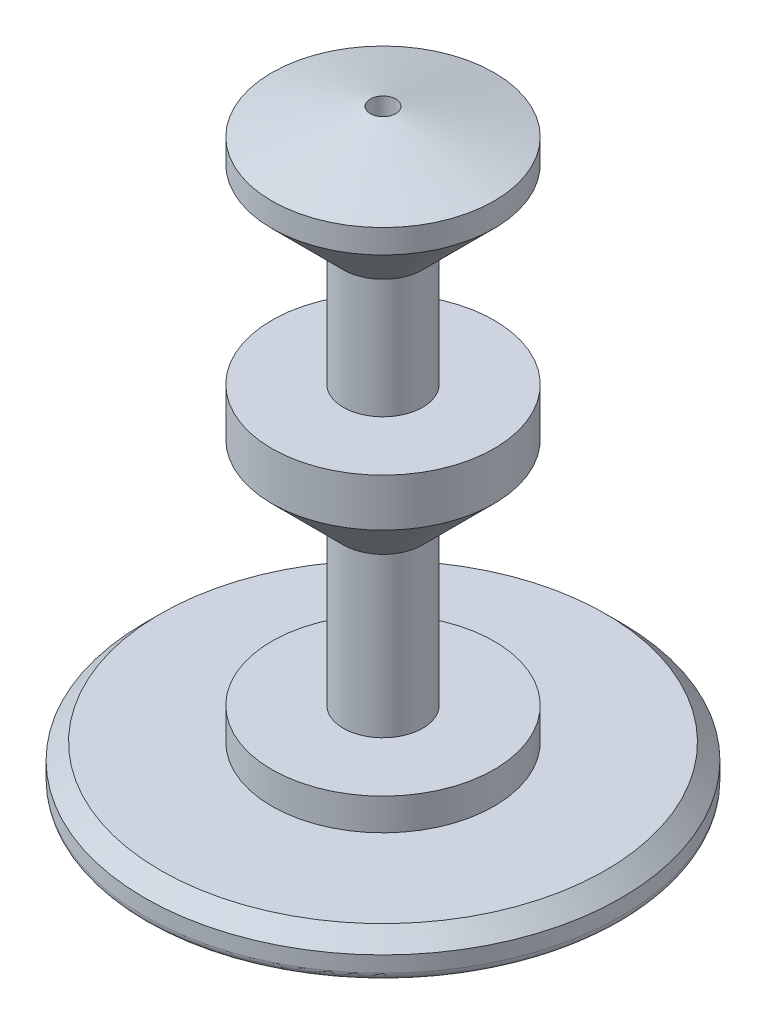
ISO-10303-21;
HEADER;
FILE_DESCRIPTION(('STEP AP214'),'2;1');
FILE_NAME('part.step','',(''),(''),'','','');
FILE_SCHEMA(('AUTOMOTIVE_DESIGN { 1 0 10303 214 1 1 1 1 }'));
ENDSEC;
DATA;
#1=APPLICATION_CONTEXT('core data for automotive mechanical design processes');
#2=APPLICATION_PROTOCOL_DEFINITION('international standard','automotive_design',2000,#1);
#3=PRODUCT_CONTEXT('',#1,'mechanical');
#4=PRODUCT('Part','Part','',(#3));
#5=PRODUCT_RELATED_PRODUCT_CATEGORY('part','',(#4));
#6=PRODUCT_DEFINITION_FORMATION('','',#4);
#7=PRODUCT_DEFINITION_CONTEXT('part definition',#1,'design');
#8=PRODUCT_DEFINITION('design','',#6,#7);
#9=PRODUCT_DEFINITION_SHAPE('','',#8);
#10=(LENGTH_UNIT() NAMED_UNIT(*) SI_UNIT(.MILLI.,.METRE.));
#11=(NAMED_UNIT(*) PLANE_ANGLE_UNIT() SI_UNIT($,.RADIAN.));
#12=(NAMED_UNIT(*) SI_UNIT($,.STERADIAN.) SOLID_ANGLE_UNIT());
#13=UNCERTAINTY_MEASURE_WITH_UNIT(LENGTH_MEASURE(1.E-05),#10,'distance_accuracy_value','');
#14=(GEOMETRIC_REPRESENTATION_CONTEXT(3) GLOBAL_UNCERTAINTY_ASSIGNED_CONTEXT((#13)) GLOBAL_UNIT_ASSIGNED_CONTEXT((#10,
#11,#12)) REPRESENTATION_CONTEXT('',''));
#15=CARTESIAN_POINT('',(0.,0.,0.));
#16=DIRECTION('',(0.,0.,1.));
#17=DIRECTION('',(1.,0.,0.));
#18=AXIS2_PLACEMENT_3D('',#15,#16,#17);
#19=CARTESIAN_POINT('',(0.,17.8951612903226,0.));
#20=DIRECTION('',(0.,-1.,0.));
#21=DIRECTION('',(0.,0.,-1.));
#22=AXIS2_PLACEMENT_3D('',#19,#20,#21);
#23=CONICAL_SURFACE('',#22,14.,1.30899693899575);
#24=CARTESIAN_POINT('',(0.,17.8951612903226,0.));
#25=DIRECTION('',(0.,1.,0.));
#26=DIRECTION('',(0.,0.,1.));
#27=AXIS2_PLACEMENT_3D('',#24,#25,#26);
#28=CIRCLE('',#27,14.);
#29=CARTESIAN_POINT('',(0.,17.8951612903226,-14.));
#30=VERTEX_POINT('',#29);
#31=EDGE_CURVE('E68',#30,#30,#28,.T.);
#32=CARTESIAN_POINT('',(0.,21.2177312764685,0.));
#33=DIRECTION('',(0.,-1.,0.));
#34=DIRECTION('',(0.,0.,-1.));
#35=AXIS2_PLACEMENT_3D('',#32,#33,#34);
#36=CIRCLE('',#35,1.6);
#37=CARTESIAN_POINT('',(0.,21.2177312764685,-1.59999999999999));
#38=VERTEX_POINT('',#37);
#39=EDGE_CURVE('E40',#38,#38,#36,.F.);
#40=CARTESIAN_POINT('',(0.,17.8951612903226,-14.));
#41=CARTESIAN_POINT('',(0.,17.9297713943449,-13.8708333333333));
#42=CARTESIAN_POINT('',(0.,17.9643814983673,-13.7416666666667));
#43=CARTESIAN_POINT('',(0.,18.033601706412,-13.4833333333333));
#44=CARTESIAN_POINT('',(0.,18.0682118104343,-13.3541666666667));
#45=CARTESIAN_POINT('',(0.,18.1374320184791,-13.0958333333333));
#46=CARTESIAN_POINT('',(0.,18.1720421225014,-12.9666666666667));
#47=CARTESIAN_POINT('',(0.,18.2412623305461,-12.7083333333333));
#48=CARTESIAN_POINT('',(0.,18.2758724345685,-12.5791666666667));
#49=CARTESIAN_POINT('',(0.,18.3450926426132,-12.3208333333333));
#50=CARTESIAN_POINT('',(0.,18.3797027466355,-12.1916666666667));
#51=CARTESIAN_POINT('',(0.,18.4489229546802,-11.9333333333333));
#52=CARTESIAN_POINT('',(0.,18.4835330587026,-11.8041666666667));
#53=CARTESIAN_POINT('',(0.,18.5527532667473,-11.5458333333333));
#54=CARTESIAN_POINT('',(0.,18.5873633707696,-11.4166666666667));
#55=CARTESIAN_POINT('',(0.,18.6565835788143,-11.1583333333333));
#56=CARTESIAN_POINT('',(0.,18.6911936828367,-11.0291666666667));
#57=CARTESIAN_POINT('',(0.,18.7604138908814,-10.7708333333333));
#58=CARTESIAN_POINT('',(0.,18.7950239949038,-10.6416666666667));
#59=CARTESIAN_POINT('',(0.,18.8642442029485,-10.3833333333333));
#60=CARTESIAN_POINT('',(0.,18.8988543069708,-10.2541666666667));
#61=CARTESIAN_POINT('',(0.,18.9680745150155,-9.99583333333334));
#62=CARTESIAN_POINT('',(0.,19.0026846190379,-9.86666666666667));
#63=CARTESIAN_POINT('',(0.,19.0719048270826,-9.60833333333334));
#64=CARTESIAN_POINT('',(0.,19.1065149311049,-9.47916666666667));
#65=CARTESIAN_POINT('',(0.,19.1757351391496,-9.22083333333334));
#66=CARTESIAN_POINT('',(0.,19.210345243172,-9.09166666666667));
#67=CARTESIAN_POINT('',(0.,19.2795654512167,-8.83333333333334));
#68=CARTESIAN_POINT('',(0.,19.3141755552391,-8.70416666666667));
#69=CARTESIAN_POINT('',(0.,19.3833957632838,-8.44583333333334));
#70=CARTESIAN_POINT('',(0.,19.4180058673061,-8.31666666666667));
#71=CARTESIAN_POINT('',(0.,19.4872260753508,-8.05833333333334));
#72=CARTESIAN_POINT('',(0.,19.5218361793732,-7.92916666666667));
#73=CARTESIAN_POINT('',(0.,19.5910563874179,-7.67083333333334));
#74=CARTESIAN_POINT('',(0.,19.6256664914402,-7.54166666666667));
#75=CARTESIAN_POINT('',(0.,19.6948866994849,-7.28333333333334));
#76=CARTESIAN_POINT('',(0.,19.7294968035073,-7.15416666666667));
#77=CARTESIAN_POINT('',(0.,19.798717011552,-6.89583333333334));
#78=CARTESIAN_POINT('',(0.,19.8333271155743,-6.76666666666667));
#79=CARTESIAN_POINT('',(0.,19.9025473236191,-6.50833333333333));
#80=CARTESIAN_POINT('',(0.,19.9371574276414,-6.37916666666667));
#81=CARTESIAN_POINT('',(0.,20.0063776356861,-6.12083333333333));
#82=CARTESIAN_POINT('',(0.,20.0409877397085,-5.99166666666667));
#83=CARTESIAN_POINT('',(0.,20.1102079477532,-5.73333333333333));
#84=CARTESIAN_POINT('',(0.,20.1448180517755,-5.60416666666667));
#85=CARTESIAN_POINT('',(0.,20.2140382598202,-5.34583333333333));
#86=CARTESIAN_POINT('',(0.,20.2486483638426,-5.21666666666667));
#87=CARTESIAN_POINT('',(0.,20.3178685718873,-4.95833333333333));
#88=CARTESIAN_POINT('',(0.,20.3524786759096,-4.82916666666666));
#89=CARTESIAN_POINT('',(0.,20.4216988839544,-4.57083333333333));
#90=CARTESIAN_POINT('',(0.,20.4563089879767,-4.44166666666666));
#91=CARTESIAN_POINT('',(0.,20.5255291960214,-4.18333333333333));
#92=CARTESIAN_POINT('',(0.,20.5601393000438,-4.05416666666667));
#93=CARTESIAN_POINT('',(0.,20.6293595080885,-3.79583333333333));
#94=CARTESIAN_POINT('',(0.,20.6639696121108,-3.66666666666666));
#95=CARTESIAN_POINT('',(0.,20.7331898201555,-3.40833333333333));
#96=CARTESIAN_POINT('',(0.,20.7677999241779,-3.27916666666666));
#97=CARTESIAN_POINT('',(0.,20.8370201322226,-3.02083333333333));
#98=CARTESIAN_POINT('',(0.,20.8716302362449,-2.89166666666666));
#99=CARTESIAN_POINT('',(0.,20.9408504442896,-2.63333333333333));
#100=CARTESIAN_POINT('',(0.,20.975460548312,-2.50416666666666));
#101=CARTESIAN_POINT('',(0.,21.0446807563567,-2.24583333333333));
#102=CARTESIAN_POINT('',(0.,21.0792908603791,-2.11666666666666));
#103=CARTESIAN_POINT('',(0.,21.1485110684238,-1.85833333333333));
#104=CARTESIAN_POINT('',(0.,21.1831211724461,-1.72916666666666));
#105=CARTESIAN_POINT('',(0.,21.2177312764685,-1.59999999999999));
#106=B_SPLINE_CURVE_WITH_KNOTS('',3,(#40,#41,#42,#43,#44,#45,#46,#47,#48,#49,#50,#51,#52,#53,
#54,#55,#56,#57,#58,#59,#60,#61,#62,#63,#64,#65,#66,#67,#68,#69,#70,#71,#72,#73,#74,#75,#76,#77,
#78,#79,#80,#81,#82,#83,#84,#85,#86,#87,#88,#89,#90,#91,#92,#93,#94,#95,#96,#97,#98,#99,#100,
#101,#102,#103,#104,#105),.UNSPECIFIED.,.F.,.F.,(4,2,2,2,2,2,2,2,2,2,2,2,2,2,2,2,2,2,2,2,2,2,2,
2,2,2,2,2,2,2,2,2,4),(0.,0.401169519908908,0.802339039817815,1.20350855972672,1.60467807963563,
2.00584759954454,2.40701711945345,2.80818663936235,3.20935615927126,3.61052567918017,
4.01169519908908,4.41286471899798,4.81403423890689,5.2152037588158,5.6163732787247,
6.01754279863361,6.41871231854252,6.81988183845143,7.22105135836033,7.62222087826924,
8.02339039817815,8.42455991808706,8.82572943799597,9.22689895790487,9.62806847781378,
10.0292379977227,10.4304075176316,10.8315770375405,11.2327465574494,11.6339160773583,
12.0350855972672,12.4362551171761,12.837424637085),.UNSPECIFIED.);
#107=EDGE_CURVE('BSEAM36',#30,#38,#106,.T.);
#108=ORIENTED_EDGE('',*,*,#31,.T.);
#109=ORIENTED_EDGE('',*,*,#39,.F.);
#110=ORIENTED_EDGE('',*,*,#107,.T.);
#111=ORIENTED_EDGE('',*,*,#107,.F.);
#112=EDGE_LOOP('',(#108,#110,#109,#111));
#113=FACE_BOUND('',#112,.T.);
#114=ADVANCED_FACE('F36',(#113),#23,.T.);
#115=CARTESIAN_POINT('',(0.,79.3548387096774,0.));
#116=DIRECTION('',(0.,1.,0.));
#117=DIRECTION('',(0.,0.,1.));
#118=AXIS2_PLACEMENT_3D('',#115,#116,#117);
#119=CYLINDRICAL_SURFACE('',#118,4.99999999999999);
#120=CARTESIAN_POINT('',(0.,-9.1048387096774,0.));
#121=DIRECTION('',(0.,1.,0.));
#122=DIRECTION('',(0.,0.,1.));
#123=AXIS2_PLACEMENT_3D('',#120,#121,#122);
#124=CIRCLE('',#123,4.99999999999999);
#125=CARTESIAN_POINT('',(0.,-9.1048387096774,4.99999999999999));
#126=VERTEX_POINT('',#125);
#127=EDGE_CURVE('E48',#126,#126,#124,.F.);
#128=ORIENTED_EDGE('',*,*,#127,.F.);
#129=EDGE_LOOP('',(#128));
#130=FACE_BOUND('',#129,.T.);
#131=CARTESIAN_POINT('',(0.,5.89516129032262,0.));
#132=DIRECTION('',(0.,-1.,0.));
#133=DIRECTION('',(0.,0.,-1.));
#134=AXIS2_PLACEMENT_3D('',#131,#132,#133);
#135=CIRCLE('',#134,4.99999999999999);
#136=CARTESIAN_POINT('',(0.,5.89516129032262,-4.99999999999999));
#137=VERTEX_POINT('',#136);
#138=EDGE_CURVE('E53',#137,#137,#135,.T.);
#139=ORIENTED_EDGE('',*,*,#138,.T.);
#140=EDGE_LOOP('',(#139));
#141=FACE_BOUND('',#140,.T.);
#142=ADVANCED_FACE('F96',(#130,#141),#119,.T.);
#143=CARTESIAN_POINT('',(0.,79.3548387096774,0.));
#144=DIRECTION('',(0.,1.,0.));
#145=DIRECTION('',(0.,0.,1.));
#146=AXIS2_PLACEMENT_3D('',#143,#144,#145);
#147=CYLINDRICAL_SURFACE('',#146,14.);
#148=ORIENTED_EDGE('',*,*,#31,.F.);
#149=EDGE_LOOP('',(#148));
#150=FACE_BOUND('',#149,.T.);
#151=CARTESIAN_POINT('',(0.,14.8951612903226,0.));
#152=DIRECTION('',(0.,1.,0.));
#153=DIRECTION('',(0.,0.,1.));
#154=AXIS2_PLACEMENT_3D('',#151,#152,#153);
#155=CIRCLE('',#154,14.);
#156=CARTESIAN_POINT('',(0.,14.8951612903226,14.));
#157=VERTEX_POINT('',#156);
#158=EDGE_CURVE('E71',#157,#157,#155,.T.);
#159=ORIENTED_EDGE('',*,*,#158,.T.);
#160=EDGE_LOOP('',(#159));
#161=FACE_BOUND('',#160,.T.);
#162=ADVANCED_FACE('F102',(#150,#161),#147,.T.);
#163=CARTESIAN_POINT('',(0.,14.8951612903226,0.));
#164=DIRECTION('',(0.,1.,0.));
#165=DIRECTION('',(0.,0.,1.));
#166=AXIS2_PLACEMENT_3D('',#163,#164,#165);
#167=CONICAL_SURFACE('',#166,14.0000000000001,0.785398163397454);
#168=ORIENTED_EDGE('',*,*,#138,.F.);
#169=EDGE_LOOP('',(#168));
#170=FACE_BOUND('',#169,.T.);
#171=ORIENTED_EDGE('',*,*,#158,.F.);
#172=EDGE_LOOP('',(#171));
#173=FACE_BOUND('',#172,.T.);
#174=ADVANCED_FACE('F111',(#170,#173),#167,.T.);
#175=CARTESIAN_POINT('',(0.,-9.10483870967741,0.));
#176=DIRECTION('',(0.,-1.,0.));
#177=DIRECTION('',(0.,0.,-1.));
#178=AXIS2_PLACEMENT_3D('',#175,#176,#177);
#179=CYLINDRICAL_SURFACE('',#178,14.);
#180=CARTESIAN_POINT('',(0.,-15.1048387096774,0.));
#181=DIRECTION('',(0.,1.,0.));
#182=DIRECTION('',(0.,0.,1.));
#183=AXIS2_PLACEMENT_3D('',#180,#181,#182);
#184=CIRCLE('',#183,14.);
#185=CARTESIAN_POINT('',(0.,-15.1048387096774,14.));
#186=VERTEX_POINT('',#185);
#187=EDGE_CURVE('E12',#186,#186,#184,.T.);
#188=ORIENTED_EDGE('',*,*,#187,.T.);
#189=EDGE_LOOP('',(#188));
#190=FACE_BOUND('',#189,.T.);
#191=CARTESIAN_POINT('',(0.,-9.10483870967741,0.));
#192=DIRECTION('',(0.,1.,0.));
#193=DIRECTION('',(0.,0.,1.));
#194=AXIS2_PLACEMENT_3D('',#191,#192,#193);
#195=CIRCLE('',#194,14.);
#196=CARTESIAN_POINT('',(0.,-9.10483870967741,14.));
#197=VERTEX_POINT('',#196);
#198=EDGE_CURVE('E83',#197,#197,#195,.T.);
#199=ORIENTED_EDGE('',*,*,#198,.F.);
#200=EDGE_LOOP('',(#199));
#201=FACE_BOUND('',#200,.T.);
#202=ADVANCED_FACE('F123',(#190,#201),#179,.T.);
#203=CARTESIAN_POINT('',(0.,-9.10483870967741,0.));
#204=DIRECTION('',(0.,1.,0.));
#205=DIRECTION('',(0.,0.,1.));
#206=AXIS2_PLACEMENT_3D('',#203,#204,#205);
#207=PLANE('',#206);
#208=ORIENTED_EDGE('',*,*,#127,.T.);
#209=EDGE_LOOP('',(#208));
#210=FACE_BOUND('',#209,.T.);
#211=ORIENTED_EDGE('',*,*,#198,.T.);
#212=EDGE_LOOP('',(#211));
#213=FACE_BOUND('',#212,.T.);
#214=ADVANCED_FACE('F128',(#210,#213),#207,.T.);
#215=CARTESIAN_POINT('',(-30.,-53.1048387096774,0.));
#216=DIRECTION('',(0.,-1.,0.));
#217=DIRECTION('',(0.,0.,-1.));
#218=AXIS2_PLACEMENT_3D('',#215,#216,#217);
#219=PLANE('',#218);
#220=CARTESIAN_POINT('',(0.,-53.1048387096774,0.));
#221=DIRECTION('',(0.,-1.,0.));
#222=DIRECTION('',(0.,0.,-1.));
#223=AXIS2_PLACEMENT_3D('',#220,#221,#222);
#224=CIRCLE('',#223,29.);
#225=CARTESIAN_POINT('',(0.,-53.1048387096774,-29.));
#226=VERTEX_POINT('',#225);
#227=EDGE_CURVE('E56',#226,#226,#224,.T.);
#228=ORIENTED_EDGE('',*,*,#227,.T.);
#229=EDGE_LOOP('',(#228));
#230=FACE_BOUND('',#229,.T.);
#231=ADVANCED_FACE('F108',(#230),#219,.T.);
#232=CARTESIAN_POINT('',(0.,-52.1048387096774,0.));
#233=DIRECTION('',(0.,-1.,0.));
#234=DIRECTION('',(0.,0.,-1.));
#235=AXIS2_PLACEMENT_3D('',#232,#233,#234);
#236=TOROIDAL_SURFACE('',#235,29.,1.);
#237=ORIENTED_EDGE('',*,*,#227,.F.);
#238=EDGE_LOOP('',(#237));
#239=FACE_BOUND('',#238,.T.);
#240=CARTESIAN_POINT('',(0.,-52.1048387096774,0.));
#241=DIRECTION('',(0.,-1.,0.));
#242=DIRECTION('',(0.,0.,-1.));
#243=AXIS2_PLACEMENT_3D('',#240,#241,#242);
#244=CIRCLE('',#243,30.);
#245=CARTESIAN_POINT('',(0.,-52.1048387096774,-30.));
#246=VERTEX_POINT('',#245);
#247=EDGE_CURVE('E59',#246,#246,#244,.F.);
#248=ORIENTED_EDGE('',*,*,#247,.F.);
#249=EDGE_LOOP('',(#248));
#250=FACE_BOUND('',#249,.T.);
#251=ADVANCED_FACE('F119',(#239,#250),#236,.T.);
#252=CARTESIAN_POINT('',(0.,79.3548387096774,0.));
#253=DIRECTION('',(0.,1.,0.));
#254=DIRECTION('',(0.,0.,1.));
#255=AXIS2_PLACEMENT_3D('',#252,#253,#254);
#256=CYLINDRICAL_SURFACE('',#255,30.);
#257=ORIENTED_EDGE('',*,*,#247,.T.);
#258=EDGE_LOOP('',(#257));
#259=FACE_BOUND('',#258,.T.);
#260=CARTESIAN_POINT('',(0.,-50.1048387096775,0.));
#261=DIRECTION('',(0.,1.,0.));
#262=DIRECTION('',(0.,0.,1.));
#263=AXIS2_PLACEMENT_3D('',#260,#261,#262);
#264=CIRCLE('',#263,30.);
#265=CARTESIAN_POINT('',(0.,-50.1048387096775,30.));
#266=VERTEX_POINT('',#265);
#267=EDGE_CURVE('E62',#266,#266,#264,.F.);
#268=ORIENTED_EDGE('',*,*,#267,.T.);
#269=EDGE_LOOP('',(#268));
#270=FACE_BOUND('',#269,.T.);
#271=ADVANCED_FACE('F117',(#259,#270),#256,.T.);
#272=CARTESIAN_POINT('',(0.,-48.1048387096774,0.));
#273=DIRECTION('',(0.,-1.,0.));
#274=DIRECTION('',(0.,0.,-1.));
#275=AXIS2_PLACEMENT_3D('',#272,#273,#274);
#276=CONICAL_SURFACE('',#275,27.9999999999999,0.785398163397452);
#277=ORIENTED_EDGE('',*,*,#267,.F.);
#278=EDGE_LOOP('',(#277));
#279=FACE_BOUND('',#278,.T.);
#280=CARTESIAN_POINT('',(0.,-48.1048387096774,0.));
#281=DIRECTION('',(0.,1.,0.));
#282=DIRECTION('',(0.,0.,1.));
#283=AXIS2_PLACEMENT_3D('',#280,#281,#282);
#284=CIRCLE('',#283,27.9999999999999);
#285=CARTESIAN_POINT('',(0.,-48.1048387096774,27.9999999999999));
#286=VERTEX_POINT('',#285);
#287=EDGE_CURVE('E65',#286,#286,#284,.T.);
#288=ORIENTED_EDGE('',*,*,#287,.F.);
#289=EDGE_LOOP('',(#288));
#290=FACE_BOUND('',#289,.T.);
#291=ADVANCED_FACE('F113',(#279,#290),#276,.T.);
#292=CARTESIAN_POINT('',(-30.,-48.1048387096774,0.));
#293=DIRECTION('',(0.,1.,0.));
#294=DIRECTION('',(0.,0.,1.));
#295=AXIS2_PLACEMENT_3D('',#292,#293,#294);
#296=PLANE('',#295);
#297=ORIENTED_EDGE('',*,*,#287,.T.);
#298=EDGE_LOOP('',(#297));
#299=FACE_BOUND('',#298,.T.);
#300=CARTESIAN_POINT('',(0.,-48.1048387096774,0.));
#301=DIRECTION('',(0.,1.,0.));
#302=DIRECTION('',(0.,0.,1.));
#303=AXIS2_PLACEMENT_3D('',#300,#301,#302);
#304=CIRCLE('',#303,14.);
#305=CARTESIAN_POINT('',(0.,-48.1048387096774,14.));
#306=VERTEX_POINT('',#305);
#307=EDGE_CURVE('E80',#306,#306,#304,.T.);
#308=ORIENTED_EDGE('',*,*,#307,.F.);
#309=EDGE_LOOP('',(#308));
#310=FACE_BOUND('',#309,.T.);
#311=ADVANCED_FACE('F116',(#299,#310),#296,.T.);
#312=CARTESIAN_POINT('',(0.,79.3548387096774,0.));
#313=DIRECTION('',(0.,1.,0.));
#314=DIRECTION('',(0.,0.,1.));
#315=AXIS2_PLACEMENT_3D('',#312,#313,#314);
#316=CYLINDRICAL_SURFACE('',#315,14.);
#317=ORIENTED_EDGE('',*,*,#307,.T.);
#318=EDGE_LOOP('',(#317));
#319=FACE_BOUND('',#318,.T.);
#320=CARTESIAN_POINT('',(0.,-44.1048387096774,0.));
#321=DIRECTION('',(0.,1.,0.));
#322=DIRECTION('',(0.,0.,1.));
#323=AXIS2_PLACEMENT_3D('',#320,#321,#322);
#324=CIRCLE('',#323,14.);
#325=CARTESIAN_POINT('',(0.,-44.1048387096774,14.));
#326=VERTEX_POINT('',#325);
#327=EDGE_CURVE('E77',#326,#326,#324,.T.);
#328=ORIENTED_EDGE('',*,*,#327,.F.);
#329=EDGE_LOOP('',(#328));
#330=FACE_BOUND('',#329,.T.);
#331=ADVANCED_FACE('F148',(#319,#330),#316,.T.);
#332=CARTESIAN_POINT('',(-14.,-44.1048387096774,0.));
#333=DIRECTION('',(0.,1.,0.));
#334=DIRECTION('',(0.,0.,1.));
#335=AXIS2_PLACEMENT_3D('',#332,#333,#334);
#336=PLANE('',#335);
#337=ORIENTED_EDGE('',*,*,#327,.T.);
#338=EDGE_LOOP('',(#337));
#339=FACE_BOUND('',#338,.T.);
#340=CARTESIAN_POINT('',(0.,-44.1048387096774,0.));
#341=DIRECTION('',(0.,1.,0.));
#342=DIRECTION('',(0.,0.,1.));
#343=AXIS2_PLACEMENT_3D('',#340,#341,#342);
#344=CIRCLE('',#343,4.99999999999999);
#345=CARTESIAN_POINT('',(0.,-44.1048387096774,4.99999999999999));
#346=VERTEX_POINT('',#345);
#347=EDGE_CURVE('E74',#346,#346,#344,.T.);
#348=ORIENTED_EDGE('',*,*,#347,.F.);
#349=EDGE_LOOP('',(#348));
#350=FACE_BOUND('',#349,.T.);
#351=ADVANCED_FACE('F152',(#339,#350),#336,.T.);
#352=CARTESIAN_POINT('',(0.,-24.1048387096774,0.));
#353=DIRECTION('',(0.,1.,0.));
#354=DIRECTION('',(0.,0.,1.));
#355=AXIS2_PLACEMENT_3D('',#352,#353,#354);
#356=CIRCLE('',#355,4.99999999999999);
#357=CARTESIAN_POINT('',(0.,-24.1048387096774,4.99999999999999));
#358=VERTEX_POINT('',#357);
#359=EDGE_CURVE('E44',#358,#358,#356,.F.);
#360=ORIENTED_EDGE('',*,*,#359,.T.);
#361=EDGE_LOOP('',(#360));
#362=FACE_BOUND('',#361,.T.);
#363=ORIENTED_EDGE('',*,*,#347,.T.);
#364=EDGE_LOOP('',(#363));
#365=FACE_BOUND('',#364,.T.);
#366=ADVANCED_FACE('F105',(#362,#365),#119,.T.);
#367=CARTESIAN_POINT('',(0.,-24.1048387096774,0.));
#368=DIRECTION('',(0.,1.,0.));
#369=DIRECTION('',(0.,0.,1.));
#370=AXIS2_PLACEMENT_3D('',#367,#368,#369);
#371=CONICAL_SURFACE('',#370,4.99999999999999,0.785398163397449);
#372=ORIENTED_EDGE('',*,*,#187,.F.);
#373=EDGE_LOOP('',(#372));
#374=FACE_BOUND('',#373,.T.);
#375=ORIENTED_EDGE('',*,*,#359,.F.);
#376=EDGE_LOOP('',(#375));
#377=FACE_BOUND('',#376,.T.);
#378=ADVANCED_FACE('F38',(#374,#377),#371,.T.);
#379=CARTESIAN_POINT('',(0.,16.2445261957116,0.));
#380=DIRECTION('',(0.,1.,0.));
#381=DIRECTION('',(0.,0.,1.));
#382=AXIS2_PLACEMENT_3D('',#379,#380,#381);
#383=CYLINDRICAL_SURFACE('',#382,1.6);
#384=CARTESIAN_POINT('',(0.,16.2445261957116,0.));
#385=DIRECTION('',(0.,-1.,0.));
#386=DIRECTION('',(0.,0.,-1.));
#387=AXIS2_PLACEMENT_3D('',#384,#385,#386);
#388=CIRCLE('',#387,1.6);
#389=CARTESIAN_POINT('',(0.,16.2445261957116,-1.6));
#390=VERTEX_POINT('',#389);
#391=EDGE_CURVE('E86',#390,#390,#388,.T.);
#392=ORIENTED_EDGE('',*,*,#391,.T.);
#393=EDGE_LOOP('',(#392));
#394=FACE_BOUND('',#393,.T.);
#395=ORIENTED_EDGE('',*,*,#39,.T.);
#396=EDGE_LOOP('',(#395));
#397=FACE_BOUND('',#396,.T.);
#398=ADVANCED_FACE('F93',(#394,#397),#383,.F.);
#399=CARTESIAN_POINT('',(0.,16.2445261957116,0.));
#400=DIRECTION('',(0.,-1.,0.));
#401=DIRECTION('',(0.,0.,-1.));
#402=AXIS2_PLACEMENT_3D('',#399,#400,#401);
#403=PLANE('',#402);
#404=ORIENTED_EDGE('',*,*,#391,.F.);
#405=EDGE_LOOP('',(#404));
#406=FACE_BOUND('',#405,.T.);
#407=ADVANCED_FACE('F174',(#406),#403,.F.);
#408=CLOSED_SHELL('',(#114,#142,#162,#174,#202,#214,#231,#251,#271,#291,#311,#331,#351,#366,
#378,#398,#407));
#409=MANIFOLD_SOLID_BREP('B2',#408);
#410=ADVANCED_BREP_SHAPE_REPRESENTATION('',(#18,#409),#14);
#411=SHAPE_DEFINITION_REPRESENTATION(#9,#410);
ENDSEC;
END-ISO-10303-21;
